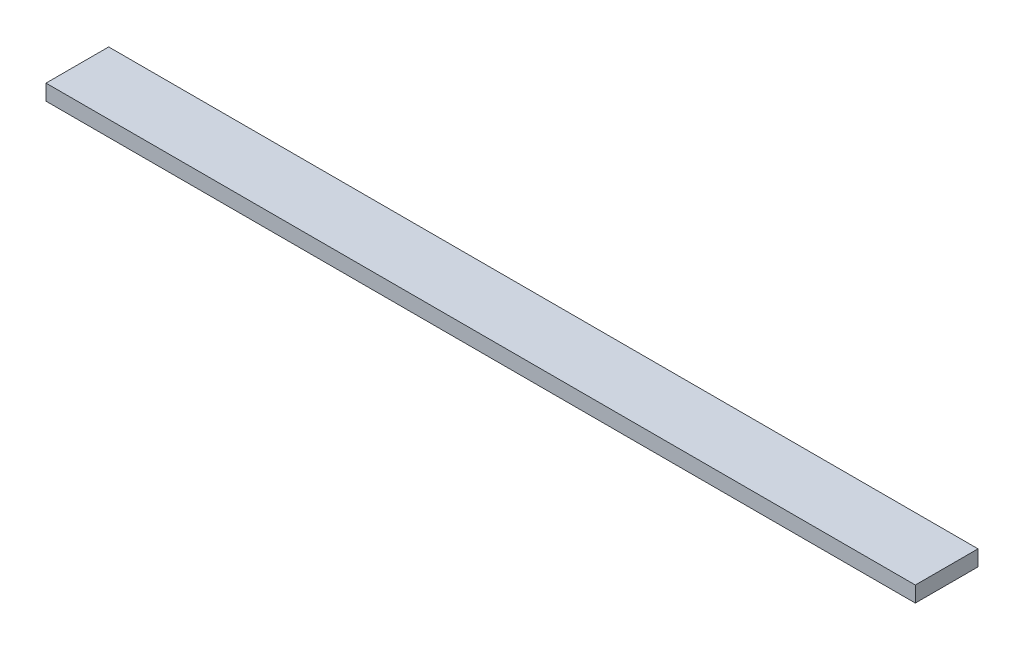
ISO-10303-21;
HEADER;
FILE_DESCRIPTION(('STEP AP214'),'2;1');
FILE_NAME('part.step','',(''),(''),'','','');
FILE_SCHEMA(('AUTOMOTIVE_DESIGN { 1 0 10303 214 1 1 1 1 }'));
ENDSEC;
DATA;
#1=APPLICATION_CONTEXT('core data for automotive mechanical design processes');
#2=APPLICATION_PROTOCOL_DEFINITION('international standard','automotive_design',2000,#1);
#3=PRODUCT_CONTEXT('',#1,'mechanical');
#4=PRODUCT('Part','Part','',(#3));
#5=PRODUCT_RELATED_PRODUCT_CATEGORY('part','',(#4));
#6=PRODUCT_DEFINITION_FORMATION('','',#4);
#7=PRODUCT_DEFINITION_CONTEXT('part definition',#1,'design');
#8=PRODUCT_DEFINITION('design','',#6,#7);
#9=PRODUCT_DEFINITION_SHAPE('','',#8);
#10=(LENGTH_UNIT() NAMED_UNIT(*) SI_UNIT(.MILLI.,.METRE.));
#11=(NAMED_UNIT(*) PLANE_ANGLE_UNIT() SI_UNIT($,.RADIAN.));
#12=(NAMED_UNIT(*) SI_UNIT($,.STERADIAN.) SOLID_ANGLE_UNIT());
#13=UNCERTAINTY_MEASURE_WITH_UNIT(LENGTH_MEASURE(1.E-05),#10,'distance_accuracy_value','');
#14=(GEOMETRIC_REPRESENTATION_CONTEXT(3) GLOBAL_UNCERTAINTY_ASSIGNED_CONTEXT((#13)) GLOBAL_UNIT_ASSIGNED_CONTEXT((#10,
#11,#12)) REPRESENTATION_CONTEXT('',''));
#15=CARTESIAN_POINT('',(0.,0.,0.));
#16=DIRECTION('',(0.,0.,1.));
#17=DIRECTION('',(1.,0.,0.));
#18=AXIS2_PLACEMENT_3D('',#15,#16,#17);
#19=CARTESIAN_POINT('',(-88.0745,3.175,-6.35));
#20=DIRECTION('',(1.,0.,0.));
#21=DIRECTION('',(0.,0.,-1.));
#22=AXIS2_PLACEMENT_3D('',#19,#20,#21);
#23=PLANE('',#22);
#24=DIRECTION('',(0.,0.,1.));
#25=VECTOR('',#24,1.);
#26=CARTESIAN_POINT('',(-88.0745,0.,-6.35));
#27=LINE('',#26,#25);
#28=CARTESIAN_POINT('',(-88.0745,0.,-6.35));
#29=VERTEX_POINT('',#28);
#30=CARTESIAN_POINT('',(-88.0745,0.,6.35));
#31=VERTEX_POINT('',#30);
#32=EDGE_CURVE('E96',#29,#31,#27,.T.);
#33=ORIENTED_EDGE('',*,*,#32,.T.);
#34=DIRECTION('',(0.,-1.,0.));
#35=VECTOR('',#34,1.);
#36=CARTESIAN_POINT('',(-88.0745,3.175,6.35));
#37=LINE('',#36,#35);
#38=CARTESIAN_POINT('',(-88.0745,3.175,6.35));
#39=VERTEX_POINT('',#38);
#40=EDGE_CURVE('E11',#39,#31,#37,.T.);
#41=ORIENTED_EDGE('',*,*,#40,.F.);
#42=DIRECTION('',(0.,0.,1.));
#43=VECTOR('',#42,1.);
#44=CARTESIAN_POINT('',(-88.0745,3.175,-6.35));
#45=LINE('',#44,#43);
#46=CARTESIAN_POINT('',(-88.0745,3.175,-6.35));
#47=VERTEX_POINT('',#46);
#48=EDGE_CURVE('E84',#47,#39,#45,.T.);
#49=ORIENTED_EDGE('',*,*,#48,.F.);
#50=DIRECTION('',(0.,-1.,0.));
#51=VECTOR('',#50,1.);
#52=CARTESIAN_POINT('',(-88.0745,3.175,-6.35));
#53=LINE('',#52,#51);
#54=EDGE_CURVE('E92',#47,#29,#53,.T.);
#55=ORIENTED_EDGE('',*,*,#54,.T.);
#56=EDGE_LOOP('',(#33,#41,#49,#55));
#57=FACE_BOUND('',#56,.T.);
#58=ADVANCED_FACE('F33',(#57),#23,.F.);
#59=CARTESIAN_POINT('',(-88.0745,3.175,6.35));
#60=DIRECTION('',(0.,0.,-1.));
#61=DIRECTION('',(-1.,0.,0.));
#62=AXIS2_PLACEMENT_3D('',#59,#60,#61);
#63=PLANE('',#62);
#64=DIRECTION('',(1.,0.,0.));
#65=VECTOR('',#64,1.);
#66=CARTESIAN_POINT('',(-88.0745,0.,6.35));
#67=LINE('',#66,#65);
#68=CARTESIAN_POINT('',(88.0745,0.,6.34999999999999));
#69=VERTEX_POINT('',#68);
#70=EDGE_CURVE('E88',#31,#69,#67,.T.);
#71=ORIENTED_EDGE('',*,*,#70,.T.);
#72=DIRECTION('',(0.,-1.,0.));
#73=VECTOR('',#72,1.);
#74=CARTESIAN_POINT('',(88.0745,3.175,6.34999999999999));
#75=LINE('',#74,#73);
#76=CARTESIAN_POINT('',(88.0745,3.175,6.34999999999999));
#77=VERTEX_POINT('',#76);
#78=EDGE_CURVE('E41',#77,#69,#75,.T.);
#79=ORIENTED_EDGE('',*,*,#78,.F.);
#80=DIRECTION('',(1.,0.,0.));
#81=VECTOR('',#80,1.);
#82=CARTESIAN_POINT('',(-88.0745,3.175,6.35));
#83=LINE('',#82,#81);
#84=EDGE_CURVE('E79',#39,#77,#83,.T.);
#85=ORIENTED_EDGE('',*,*,#84,.F.);
#86=ORIENTED_EDGE('',*,*,#40,.T.);
#87=EDGE_LOOP('',(#71,#79,#85,#86));
#88=FACE_BOUND('',#87,.T.);
#89=ADVANCED_FACE('F87',(#88),#63,.F.);
#90=CARTESIAN_POINT('',(88.0745,3.175,-6.35));
#91=DIRECTION('',(-1.,0.,0.));
#92=DIRECTION('',(0.,0.,1.));
#93=AXIS2_PLACEMENT_3D('',#90,#91,#92);
#94=PLANE('',#93);
#95=DIRECTION('',(0.,0.,-1.));
#96=VECTOR('',#95,1.);
#97=CARTESIAN_POINT('',(88.0745,0.,-6.35));
#98=LINE('',#97,#96);
#99=CARTESIAN_POINT('',(88.0745,0.,-6.35));
#100=VERTEX_POINT('',#99);
#101=EDGE_CURVE('E66',#69,#100,#98,.T.);
#102=ORIENTED_EDGE('',*,*,#101,.T.);
#103=DIRECTION('',(0.,-1.,0.));
#104=VECTOR('',#103,1.);
#105=CARTESIAN_POINT('',(88.0745,3.175,-6.35));
#106=LINE('',#105,#104);
#107=CARTESIAN_POINT('',(88.0745,3.175,-6.35));
#108=VERTEX_POINT('',#107);
#109=EDGE_CURVE('E89',#108,#100,#106,.T.);
#110=ORIENTED_EDGE('',*,*,#109,.F.);
#111=DIRECTION('',(0.,0.,-1.));
#112=VECTOR('',#111,1.);
#113=CARTESIAN_POINT('',(88.0745,3.175,-6.35));
#114=LINE('',#113,#112);
#115=EDGE_CURVE('E82',#77,#108,#114,.T.);
#116=ORIENTED_EDGE('',*,*,#115,.F.);
#117=ORIENTED_EDGE('',*,*,#78,.T.);
#118=EDGE_LOOP('',(#102,#110,#116,#117));
#119=FACE_BOUND('',#118,.T.);
#120=ADVANCED_FACE('F90',(#119),#94,.F.);
#121=CARTESIAN_POINT('',(-88.0745,3.175,-6.35));
#122=DIRECTION('',(0.,0.,1.));
#123=DIRECTION('',(1.,0.,0.));
#124=AXIS2_PLACEMENT_3D('',#121,#122,#123);
#125=PLANE('',#124);
#126=DIRECTION('',(-1.,0.,0.));
#127=VECTOR('',#126,1.);
#128=CARTESIAN_POINT('',(-88.0745,0.,-6.35));
#129=LINE('',#128,#127);
#130=EDGE_CURVE('E72',#100,#29,#129,.T.);
#131=ORIENTED_EDGE('',*,*,#130,.T.);
#132=ORIENTED_EDGE('',*,*,#54,.F.);
#133=DIRECTION('',(-1.,0.,0.));
#134=VECTOR('',#133,1.);
#135=CARTESIAN_POINT('',(-88.0745,3.175,-6.35));
#136=LINE('',#135,#134);
#137=EDGE_CURVE('E49',#108,#47,#136,.T.);
#138=ORIENTED_EDGE('',*,*,#137,.F.);
#139=ORIENTED_EDGE('',*,*,#109,.T.);
#140=EDGE_LOOP('',(#131,#132,#138,#139));
#141=FACE_BOUND('',#140,.T.);
#142=ADVANCED_FACE('F103',(#141),#125,.F.);
#143=CARTESIAN_POINT('',(0.,3.175,0.));
#144=DIRECTION('',(0.,1.,0.));
#145=DIRECTION('',(0.,0.,1.));
#146=AXIS2_PLACEMENT_3D('',#143,#144,#145);
#147=PLANE('',#146);
#148=ORIENTED_EDGE('',*,*,#48,.T.);
#149=ORIENTED_EDGE('',*,*,#84,.T.);
#150=ORIENTED_EDGE('',*,*,#115,.T.);
#151=ORIENTED_EDGE('',*,*,#137,.T.);
#152=EDGE_LOOP('',(#148,#149,#150,#151));
#153=FACE_BOUND('',#152,.T.);
#154=ADVANCED_FACE('F80',(#153),#147,.T.);
#155=CARTESIAN_POINT('',(0.,0.,0.));
#156=DIRECTION('',(0.,1.,0.));
#157=DIRECTION('',(0.,0.,1.));
#158=AXIS2_PLACEMENT_3D('',#155,#156,#157);
#159=PLANE('',#158);
#160=ORIENTED_EDGE('',*,*,#32,.F.);
#161=ORIENTED_EDGE('',*,*,#130,.F.);
#162=ORIENTED_EDGE('',*,*,#101,.F.);
#163=ORIENTED_EDGE('',*,*,#70,.F.);
#164=EDGE_LOOP('',(#160,#161,#162,#163));
#165=FACE_BOUND('',#164,.T.);
#166=ADVANCED_FACE('F106',(#165),#159,.F.);
#167=CLOSED_SHELL('',(#58,#89,#120,#142,#154,#166));
#168=MANIFOLD_SOLID_BREP('B2',#167);
#169=ADVANCED_BREP_SHAPE_REPRESENTATION('',(#18,#168),#14);
#170=SHAPE_DEFINITION_REPRESENTATION(#9,#169);
ENDSEC;
END-ISO-10303-21;
